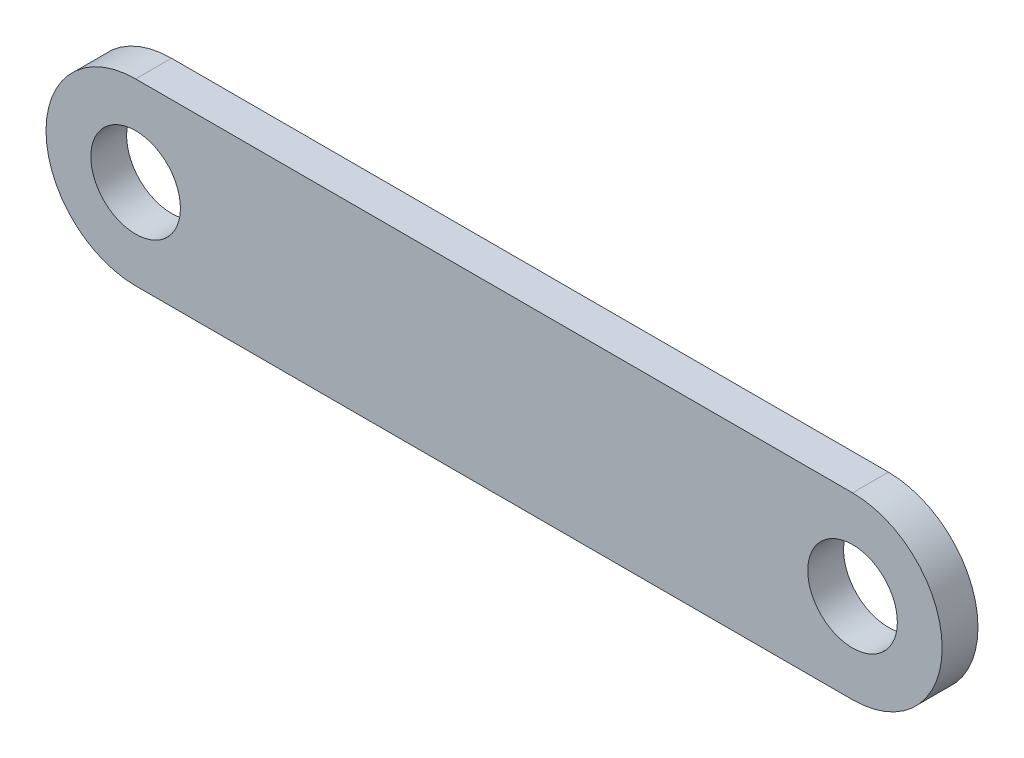
ISO-10303-21;
HEADER;
FILE_DESCRIPTION(('STEP AP214'),'2;1');
FILE_NAME('part.step','',(''),(''),'','','');
FILE_SCHEMA(('AUTOMOTIVE_DESIGN { 1 0 10303 214 1 1 1 1 }'));
ENDSEC;
DATA;
#1=APPLICATION_CONTEXT('core data for automotive mechanical design processes');
#2=APPLICATION_PROTOCOL_DEFINITION('international standard','automotive_design',2000,#1);
#3=PRODUCT_CONTEXT('',#1,'mechanical');
#4=PRODUCT('Part','Part','',(#3));
#5=PRODUCT_RELATED_PRODUCT_CATEGORY('part','',(#4));
#6=PRODUCT_DEFINITION_FORMATION('','',#4);
#7=PRODUCT_DEFINITION_CONTEXT('part definition',#1,'design');
#8=PRODUCT_DEFINITION('design','',#6,#7);
#9=PRODUCT_DEFINITION_SHAPE('','',#8);
#10=(LENGTH_UNIT() NAMED_UNIT(*) SI_UNIT(.MILLI.,.METRE.));
#11=(NAMED_UNIT(*) PLANE_ANGLE_UNIT() SI_UNIT($,.RADIAN.));
#12=(NAMED_UNIT(*) SI_UNIT($,.STERADIAN.) SOLID_ANGLE_UNIT());
#13=UNCERTAINTY_MEASURE_WITH_UNIT(LENGTH_MEASURE(1.E-05),#10,'distance_accuracy_value','');
#14=(GEOMETRIC_REPRESENTATION_CONTEXT(3) GLOBAL_UNCERTAINTY_ASSIGNED_CONTEXT((#13)) GLOBAL_UNIT_ASSIGNED_CONTEXT((#10,
#11,#12)) REPRESENTATION_CONTEXT('',''));
#15=CARTESIAN_POINT('',(0.,0.,0.));
#16=DIRECTION('',(0.,0.,1.));
#17=DIRECTION('',(1.,0.,0.));
#18=AXIS2_PLACEMENT_3D('',#15,#16,#17);
#19=CARTESIAN_POINT('',(0.,0.,4.));
#20=DIRECTION('',(0.,0.,1.));
#21=DIRECTION('',(1.,0.,0.));
#22=AXIS2_PLACEMENT_3D('',#19,#20,#21);
#23=PLANE('',#22);
#24=CARTESIAN_POINT('',(0.,0.,4.));
#25=DIRECTION('',(0.,0.,1.));
#26=DIRECTION('',(1.,0.,0.));
#27=AXIS2_PLACEMENT_3D('',#24,#25,#26);
#28=CIRCLE('',#27,5.);
#29=CARTESIAN_POINT('',(5.,0.,4.));
#30=VERTEX_POINT('',#29);
#31=EDGE_CURVE('E100',#30,#30,#28,.T.);
#32=ORIENTED_EDGE('',*,*,#31,.F.);
#33=EDGE_LOOP('',(#32));
#34=FACE_BOUND('',#33,.T.);
#35=CARTESIAN_POINT('',(0.,0.,4.));
#36=DIRECTION('',(0.,0.,1.));
#37=DIRECTION('',(1.,0.,0.));
#38=AXIS2_PLACEMENT_3D('',#35,#36,#37);
#39=CIRCLE('',#38,10.);
#40=CARTESIAN_POINT('',(0.,10.,4.));
#41=VERTEX_POINT('',#40);
#42=CARTESIAN_POINT('',(0.,-10.,4.));
#43=VERTEX_POINT('',#42);
#44=EDGE_CURVE('E85',#41,#43,#39,.T.);
#45=ORIENTED_EDGE('',*,*,#44,.T.);
#46=DIRECTION('',(1.,0.,0.));
#47=VECTOR('',#46,1.);
#48=CARTESIAN_POINT('',(0.,-10.,4.));
#49=LINE('',#48,#47);
#50=CARTESIAN_POINT('',(80.,-10.,4.));
#51=VERTEX_POINT('',#50);
#52=EDGE_CURVE('E80',#43,#51,#49,.T.);
#53=ORIENTED_EDGE('',*,*,#52,.T.);
#54=CARTESIAN_POINT('',(80.,0.,4.));
#55=DIRECTION('',(0.,0.,1.));
#56=DIRECTION('',(1.,0.,0.));
#57=AXIS2_PLACEMENT_3D('',#54,#55,#56);
#58=CIRCLE('',#57,10.);
#59=CARTESIAN_POINT('',(80.,10.,4.));
#60=VERTEX_POINT('',#59);
#61=EDGE_CURVE('E83',#51,#60,#58,.T.);
#62=ORIENTED_EDGE('',*,*,#61,.T.);
#63=DIRECTION('',(-1.,0.,0.));
#64=VECTOR('',#63,1.);
#65=CARTESIAN_POINT('',(0.,10.,4.));
#66=LINE('',#65,#64);
#67=EDGE_CURVE('E50',#60,#41,#66,.T.);
#68=ORIENTED_EDGE('',*,*,#67,.T.);
#69=EDGE_LOOP('',(#45,#53,#62,#68));
#70=FACE_BOUND('',#69,.T.);
#71=CARTESIAN_POINT('',(80.,0.,4.));
#72=DIRECTION('',(0.,0.,1.));
#73=DIRECTION('',(1.,0.,0.));
#74=AXIS2_PLACEMENT_3D('',#71,#72,#73);
#75=CIRCLE('',#74,5.);
#76=CARTESIAN_POINT('',(85.,0.,4.));
#77=VERTEX_POINT('',#76);
#78=EDGE_CURVE('E115',#77,#77,#75,.T.);
#79=ORIENTED_EDGE('',*,*,#78,.F.);
#80=EDGE_LOOP('',(#79));
#81=FACE_BOUND('',#80,.T.);
#82=ADVANCED_FACE('F33',(#34,#70,#81),#23,.T.);
#83=CARTESIAN_POINT('',(0.,0.,0.));
#84=DIRECTION('',(0.,0.,1.));
#85=DIRECTION('',(1.,0.,0.));
#86=AXIS2_PLACEMENT_3D('',#83,#84,#85);
#87=PLANE('',#86);
#88=CARTESIAN_POINT('',(0.,0.,0.));
#89=DIRECTION('',(0.,0.,1.));
#90=DIRECTION('',(1.,0.,0.));
#91=AXIS2_PLACEMENT_3D('',#88,#89,#90);
#92=CIRCLE('',#91,10.);
#93=CARTESIAN_POINT('',(0.,10.,0.));
#94=VERTEX_POINT('',#93);
#95=CARTESIAN_POINT('',(0.,-10.,0.));
#96=VERTEX_POINT('',#95);
#97=EDGE_CURVE('E97',#94,#96,#92,.T.);
#98=ORIENTED_EDGE('',*,*,#97,.F.);
#99=DIRECTION('',(-1.,0.,0.));
#100=VECTOR('',#99,1.);
#101=CARTESIAN_POINT('',(0.,10.,0.));
#102=LINE('',#101,#100);
#103=CARTESIAN_POINT('',(80.,10.,0.));
#104=VERTEX_POINT('',#103);
#105=EDGE_CURVE('E73',#104,#94,#102,.T.);
#106=ORIENTED_EDGE('',*,*,#105,.F.);
#107=CARTESIAN_POINT('',(80.,0.,0.));
#108=DIRECTION('',(0.,0.,1.));
#109=DIRECTION('',(1.,0.,0.));
#110=AXIS2_PLACEMENT_3D('',#107,#108,#109);
#111=CIRCLE('',#110,10.);
#112=CARTESIAN_POINT('',(80.,-10.,0.));
#113=VERTEX_POINT('',#112);
#114=EDGE_CURVE('E67',#113,#104,#111,.T.);
#115=ORIENTED_EDGE('',*,*,#114,.F.);
#116=DIRECTION('',(1.,0.,0.));
#117=VECTOR('',#116,1.);
#118=CARTESIAN_POINT('',(0.,-10.,0.));
#119=LINE('',#118,#117);
#120=EDGE_CURVE('E89',#96,#113,#119,.T.);
#121=ORIENTED_EDGE('',*,*,#120,.F.);
#122=EDGE_LOOP('',(#98,#106,#115,#121));
#123=FACE_BOUND('',#122,.T.);
#124=CARTESIAN_POINT('',(0.,0.,0.));
#125=DIRECTION('',(0.,0.,1.));
#126=DIRECTION('',(1.,0.,0.));
#127=AXIS2_PLACEMENT_3D('',#124,#125,#126);
#128=CIRCLE('',#127,5.);
#129=CARTESIAN_POINT('',(5.,0.,0.));
#130=VERTEX_POINT('',#129);
#131=EDGE_CURVE('E112',#130,#130,#128,.T.);
#132=ORIENTED_EDGE('',*,*,#131,.T.);
#133=EDGE_LOOP('',(#132));
#134=FACE_BOUND('',#133,.T.);
#135=CARTESIAN_POINT('',(80.,0.,0.));
#136=DIRECTION('',(0.,0.,1.));
#137=DIRECTION('',(1.,0.,0.));
#138=AXIS2_PLACEMENT_3D('',#135,#136,#137);
#139=CIRCLE('',#138,5.);
#140=CARTESIAN_POINT('',(85.,0.,0.));
#141=VERTEX_POINT('',#140);
#142=EDGE_CURVE('E118',#141,#141,#139,.T.);
#143=ORIENTED_EDGE('',*,*,#142,.T.);
#144=EDGE_LOOP('',(#143));
#145=FACE_BOUND('',#144,.T.);
#146=ADVANCED_FACE('F108',(#123,#134,#145),#87,.F.);
#147=CARTESIAN_POINT('',(0.,0.,4.));
#148=DIRECTION('',(0.,0.,-1.));
#149=DIRECTION('',(-1.,0.,0.));
#150=AXIS2_PLACEMENT_3D('',#147,#148,#149);
#151=CYLINDRICAL_SURFACE('',#150,10.);
#152=ORIENTED_EDGE('',*,*,#97,.T.);
#153=DIRECTION('',(0.,0.,-1.));
#154=VECTOR('',#153,1.);
#155=CARTESIAN_POINT('',(0.,-10.,4.));
#156=LINE('',#155,#154);
#157=EDGE_CURVE('E11',#43,#96,#156,.T.);
#158=ORIENTED_EDGE('',*,*,#157,.F.);
#159=ORIENTED_EDGE('',*,*,#44,.F.);
#160=DIRECTION('',(0.,0.,-1.));
#161=VECTOR('',#160,1.);
#162=CARTESIAN_POINT('',(0.,10.,4.));
#163=LINE('',#162,#161);
#164=EDGE_CURVE('E93',#41,#94,#163,.T.);
#165=ORIENTED_EDGE('',*,*,#164,.T.);
#166=EDGE_LOOP('',(#152,#158,#159,#165));
#167=FACE_BOUND('',#166,.T.);
#168=ADVANCED_FACE('F35',(#167),#151,.T.);
#169=CARTESIAN_POINT('',(0.,-10.,4.));
#170=DIRECTION('',(0.,1.,0.));
#171=DIRECTION('',(0.,0.,1.));
#172=AXIS2_PLACEMENT_3D('',#169,#170,#171);
#173=PLANE('',#172);
#174=ORIENTED_EDGE('',*,*,#120,.T.);
#175=DIRECTION('',(0.,0.,-1.));
#176=VECTOR('',#175,1.);
#177=CARTESIAN_POINT('',(80.,-10.,4.));
#178=LINE('',#177,#176);
#179=EDGE_CURVE('E42',#51,#113,#178,.T.);
#180=ORIENTED_EDGE('',*,*,#179,.F.);
#181=ORIENTED_EDGE('',*,*,#52,.F.);
#182=ORIENTED_EDGE('',*,*,#157,.T.);
#183=EDGE_LOOP('',(#174,#180,#181,#182));
#184=FACE_BOUND('',#183,.T.);
#185=ADVANCED_FACE('F88',(#184),#173,.F.);
#186=CARTESIAN_POINT('',(80.,0.,4.));
#187=DIRECTION('',(0.,0.,-1.));
#188=DIRECTION('',(-1.,0.,0.));
#189=AXIS2_PLACEMENT_3D('',#186,#187,#188);
#190=CYLINDRICAL_SURFACE('',#189,10.);
#191=ORIENTED_EDGE('',*,*,#114,.T.);
#192=DIRECTION('',(0.,0.,-1.));
#193=VECTOR('',#192,1.);
#194=CARTESIAN_POINT('',(80.,10.,4.));
#195=LINE('',#194,#193);
#196=EDGE_CURVE('E90',#60,#104,#195,.T.);
#197=ORIENTED_EDGE('',*,*,#196,.F.);
#198=ORIENTED_EDGE('',*,*,#61,.F.);
#199=ORIENTED_EDGE('',*,*,#179,.T.);
#200=EDGE_LOOP('',(#191,#197,#198,#199));
#201=FACE_BOUND('',#200,.T.);
#202=ADVANCED_FACE('F91',(#201),#190,.T.);
#203=CARTESIAN_POINT('',(0.,10.,4.));
#204=DIRECTION('',(0.,-1.,0.));
#205=DIRECTION('',(0.,0.,-1.));
#206=AXIS2_PLACEMENT_3D('',#203,#204,#205);
#207=PLANE('',#206);
#208=ORIENTED_EDGE('',*,*,#105,.T.);
#209=ORIENTED_EDGE('',*,*,#164,.F.);
#210=ORIENTED_EDGE('',*,*,#67,.F.);
#211=ORIENTED_EDGE('',*,*,#196,.T.);
#212=EDGE_LOOP('',(#208,#209,#210,#211));
#213=FACE_BOUND('',#212,.T.);
#214=ADVANCED_FACE('F105',(#213),#207,.F.);
#215=CARTESIAN_POINT('',(0.,0.,4.));
#216=DIRECTION('',(0.,0.,-1.));
#217=DIRECTION('',(-1.,0.,0.));
#218=AXIS2_PLACEMENT_3D('',#215,#216,#217);
#219=CYLINDRICAL_SURFACE('',#218,5.);
#220=ORIENTED_EDGE('',*,*,#31,.T.);
#221=EDGE_LOOP('',(#220));
#222=FACE_BOUND('',#221,.T.);
#223=ORIENTED_EDGE('',*,*,#131,.F.);
#224=EDGE_LOOP('',(#223));
#225=FACE_BOUND('',#224,.T.);
#226=ADVANCED_FACE('F135',(#222,#225),#219,.F.);
#227=CARTESIAN_POINT('',(80.,0.,4.));
#228=DIRECTION('',(0.,0.,-1.));
#229=DIRECTION('',(-1.,0.,0.));
#230=AXIS2_PLACEMENT_3D('',#227,#228,#229);
#231=CYLINDRICAL_SURFACE('',#230,5.);
#232=ORIENTED_EDGE('',*,*,#78,.T.);
#233=EDGE_LOOP('',(#232));
#234=FACE_BOUND('',#233,.T.);
#235=ORIENTED_EDGE('',*,*,#142,.F.);
#236=EDGE_LOOP('',(#235));
#237=FACE_BOUND('',#236,.T.);
#238=ADVANCED_FACE('F124',(#234,#237),#231,.F.);
#239=CLOSED_SHELL('',(#82,#146,#168,#185,#202,#214,#226,#238));
#240=MANIFOLD_SOLID_BREP('B2',#239);
#241=ADVANCED_BREP_SHAPE_REPRESENTATION('',(#18,#240),#14);
#242=SHAPE_DEFINITION_REPRESENTATION(#9,#241);
ENDSEC;
END-ISO-10303-21;
